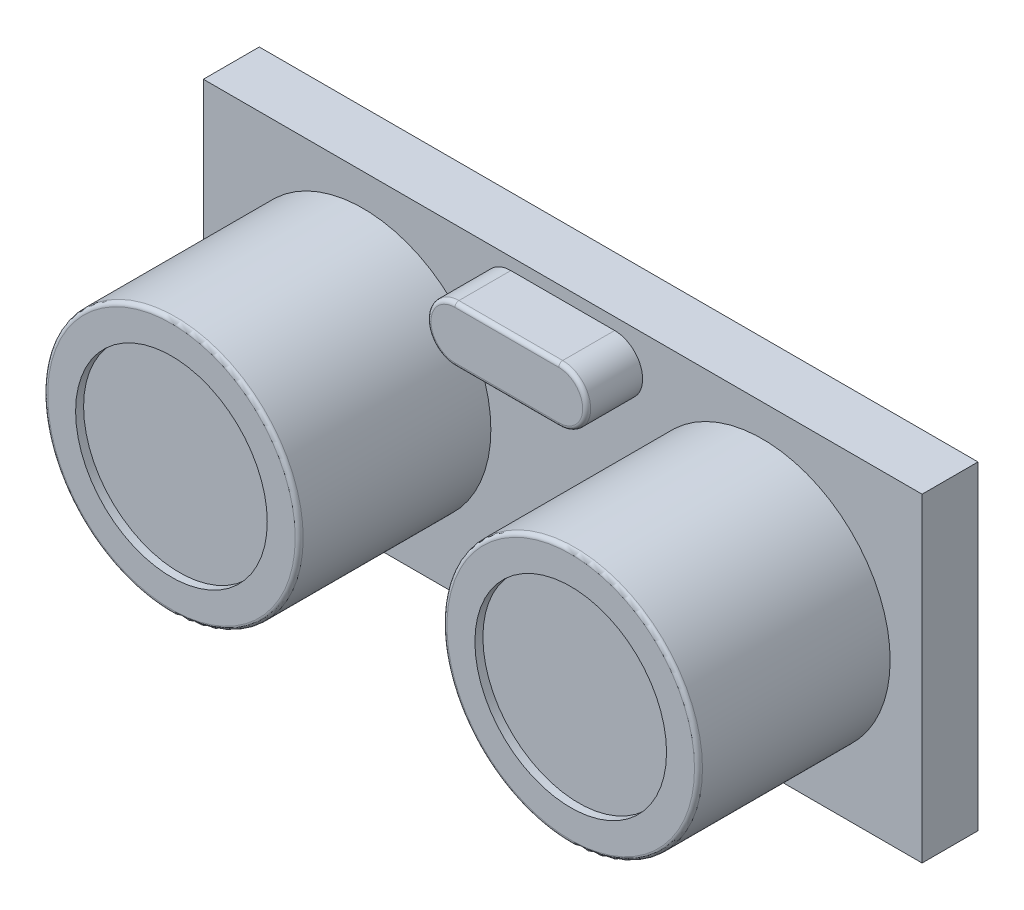
ISO-10303-21;
HEADER;
FILE_DESCRIPTION(('STEP AP214'),'2;1');
FILE_NAME('part.step','',(''),(''),'','','');
FILE_SCHEMA(('AUTOMOTIVE_DESIGN { 1 0 10303 214 1 1 1 1 }'));
ENDSEC;
DATA;
#1=APPLICATION_CONTEXT('core data for automotive mechanical design processes');
#2=APPLICATION_PROTOCOL_DEFINITION('international standard','automotive_design',2000,#1);
#3=PRODUCT_CONTEXT('',#1,'mechanical');
#4=PRODUCT('Part','Part','',(#3));
#5=PRODUCT_RELATED_PRODUCT_CATEGORY('part','',(#4));
#6=PRODUCT_DEFINITION_FORMATION('','',#4);
#7=PRODUCT_DEFINITION_CONTEXT('part definition',#1,'design');
#8=PRODUCT_DEFINITION('design','',#6,#7);
#9=PRODUCT_DEFINITION_SHAPE('','',#8);
#10=(LENGTH_UNIT() NAMED_UNIT(*) SI_UNIT(.MILLI.,.METRE.));
#11=(NAMED_UNIT(*) PLANE_ANGLE_UNIT() SI_UNIT($,.RADIAN.));
#12=(NAMED_UNIT(*) SI_UNIT($,.STERADIAN.) SOLID_ANGLE_UNIT());
#13=UNCERTAINTY_MEASURE_WITH_UNIT(LENGTH_MEASURE(1.E-05),#10,'distance_accuracy_value','');
#14=(GEOMETRIC_REPRESENTATION_CONTEXT(3) GLOBAL_UNCERTAINTY_ASSIGNED_CONTEXT((#13)) GLOBAL_UNIT_ASSIGNED_CONTEXT((#10,
#11,#12)) REPRESENTATION_CONTEXT('',''));
#15=CARTESIAN_POINT('',(0.,0.,0.));
#16=DIRECTION('',(0.,0.,1.));
#17=DIRECTION('',(1.,0.,0.));
#18=AXIS2_PLACEMENT_3D('',#15,#16,#17);
#19=CARTESIAN_POINT('',(0.,0.,3.5));
#20=DIRECTION('',(0.,0.,1.));
#21=DIRECTION('',(1.,0.,0.));
#22=AXIS2_PLACEMENT_3D('',#19,#20,#21);
#23=PLANE('',#22);
#24=CARTESIAN_POINT('',(-12.5,0.,3.5));
#25=DIRECTION('',(0.,0.,1.));
#26=DIRECTION('',(1.,0.,0.));
#27=AXIS2_PLACEMENT_3D('',#24,#25,#26);
#28=CIRCLE('',#27,8.);
#29=CARTESIAN_POINT('',(-4.49999999999999,0.,3.5));
#30=VERTEX_POINT('',#29);
#31=EDGE_CURVE('E148',#30,#30,#28,.T.);
#32=ORIENTED_EDGE('',*,*,#31,.F.);
#33=EDGE_LOOP('',(#32));
#34=FACE_BOUND('',#33,.T.);
#35=CARTESIAN_POINT('',(12.5,0.,3.5));
#36=DIRECTION('',(0.,0.,1.));
#37=DIRECTION('',(1.,0.,0.));
#38=AXIS2_PLACEMENT_3D('',#35,#36,#37);
#39=CIRCLE('',#38,8.00000000000001);
#40=CARTESIAN_POINT('',(20.5,0.,3.5));
#41=VERTEX_POINT('',#40);
#42=EDGE_CURVE('E153',#41,#41,#39,.T.);
#43=ORIENTED_EDGE('',*,*,#42,.F.);
#44=EDGE_LOOP('',(#43));
#45=FACE_BOUND('',#44,.T.);
#46=DIRECTION('',(0.,1.,0.));
#47=VECTOR('',#46,1.);
#48=CARTESIAN_POINT('',(22.5,10.,3.5));
#49=LINE('',#48,#47);
#50=CARTESIAN_POINT('',(22.5,-10.,3.5));
#51=VERTEX_POINT('',#50);
#52=CARTESIAN_POINT('',(22.5,10.,3.5));
#53=VERTEX_POINT('',#52);
#54=EDGE_CURVE('E157',#51,#53,#49,.T.);
#55=ORIENTED_EDGE('',*,*,#54,.T.);
#56=DIRECTION('',(-1.,0.,0.));
#57=VECTOR('',#56,1.);
#58=CARTESIAN_POINT('',(-22.5,10.,3.5));
#59=LINE('',#58,#57);
#60=CARTESIAN_POINT('',(-22.5,10.,3.5));
#61=VERTEX_POINT('',#60);
#62=EDGE_CURVE('E160',#53,#61,#59,.T.);
#63=ORIENTED_EDGE('',*,*,#62,.T.);
#64=DIRECTION('',(0.,-1.,0.));
#65=VECTOR('',#64,1.);
#66=CARTESIAN_POINT('',(-22.5,10.,3.5));
#67=LINE('',#66,#65);
#68=CARTESIAN_POINT('',(-22.5,-10.,3.5));
#69=VERTEX_POINT('',#68);
#70=EDGE_CURVE('E163',#61,#69,#67,.T.);
#71=ORIENTED_EDGE('',*,*,#70,.T.);
#72=DIRECTION('',(1.,0.,0.));
#73=VECTOR('',#72,1.);
#74=CARTESIAN_POINT('',(-22.5,-10.,3.5));
#75=LINE('',#74,#73);
#76=EDGE_CURVE('E165',#69,#51,#75,.T.);
#77=ORIENTED_EDGE('',*,*,#76,.T.);
#78=EDGE_LOOP('',(#55,#63,#71,#77));
#79=FACE_BOUND('',#78,.T.);
#80=DIRECTION('',(1.,0.,0.));
#81=VECTOR('',#80,1.);
#82=CARTESIAN_POINT('',(-3.25,5.75,3.5));
#83=LINE('',#82,#81);
#84=CARTESIAN_POINT('',(-3.25,5.75,3.5));
#85=VERTEX_POINT('',#84);
#86=CARTESIAN_POINT('',(3.25,5.75,3.5));
#87=VERTEX_POINT('',#86);
#88=EDGE_CURVE('E112',#85,#87,#83,.T.);
#89=ORIENTED_EDGE('',*,*,#88,.F.);
#90=CARTESIAN_POINT('',(-3.25,7.5,3.5));
#91=DIRECTION('',(0.,0.,1.));
#92=DIRECTION('',(1.,0.,0.));
#93=AXIS2_PLACEMENT_3D('',#90,#91,#92);
#94=CIRCLE('',#93,1.75);
#95=CARTESIAN_POINT('',(-3.25,9.25,3.5));
#96=VERTEX_POINT('',#95);
#97=EDGE_CURVE('E120',#96,#85,#94,.T.);
#98=ORIENTED_EDGE('',*,*,#97,.F.);
#99=DIRECTION('',(-1.,0.,0.));
#100=VECTOR('',#99,1.);
#101=CARTESIAN_POINT('',(-3.25,9.25,3.5));
#102=LINE('',#101,#100);
#103=CARTESIAN_POINT('',(3.25,9.25,3.5));
#104=VERTEX_POINT('',#103);
#105=EDGE_CURVE('E131',#104,#96,#102,.T.);
#106=ORIENTED_EDGE('',*,*,#105,.F.);
#107=CARTESIAN_POINT('',(3.25,7.5,3.5));
#108=DIRECTION('',(0.,0.,1.));
#109=DIRECTION('',(1.,0.,0.));
#110=AXIS2_PLACEMENT_3D('',#107,#108,#109);
#111=CIRCLE('',#110,1.75);
#112=EDGE_CURVE('E129',#87,#104,#111,.T.);
#113=ORIENTED_EDGE('',*,*,#112,.F.);
#114=EDGE_LOOP('',(#89,#98,#106,#113));
#115=FACE_BOUND('',#114,.T.);
#116=ADVANCED_FACE('F32',(#34,#45,#79,#115),#23,.T.);
#117=CARTESIAN_POINT('',(22.5,10.,3.5));
#118=DIRECTION('',(-1.,0.,0.));
#119=DIRECTION('',(0.,-1.,0.));
#120=AXIS2_PLACEMENT_3D('',#117,#118,#119);
#121=PLANE('',#120);
#122=DIRECTION('',(0.,1.,0.));
#123=VECTOR('',#122,1.);
#124=CARTESIAN_POINT('',(22.5,10.,0.));
#125=LINE('',#124,#123);
#126=CARTESIAN_POINT('',(22.5,-10.,0.));
#127=VERTEX_POINT('',#126);
#128=CARTESIAN_POINT('',(22.5,10.,0.));
#129=VERTEX_POINT('',#128);
#130=EDGE_CURVE('E156',#127,#129,#125,.T.);
#131=ORIENTED_EDGE('',*,*,#130,.T.);
#132=DIRECTION('',(0.,0.,-1.));
#133=VECTOR('',#132,1.);
#134=CARTESIAN_POINT('',(22.5,10.,3.5));
#135=LINE('',#134,#133);
#136=EDGE_CURVE('E183',#53,#129,#135,.T.);
#137=ORIENTED_EDGE('',*,*,#136,.F.);
#138=ORIENTED_EDGE('',*,*,#54,.F.);
#139=DIRECTION('',(0.,0.,-1.));
#140=VECTOR('',#139,1.);
#141=CARTESIAN_POINT('',(22.5,-10.,3.5));
#142=LINE('',#141,#140);
#143=EDGE_CURVE('E167',#51,#127,#142,.T.);
#144=ORIENTED_EDGE('',*,*,#143,.T.);
#145=EDGE_LOOP('',(#131,#137,#138,#144));
#146=FACE_BOUND('',#145,.T.);
#147=ADVANCED_FACE('F247',(#146),#121,.F.);
#148=CARTESIAN_POINT('',(-22.5,10.,3.5));
#149=DIRECTION('',(0.,-1.,0.));
#150=DIRECTION('',(0.,0.,-1.));
#151=AXIS2_PLACEMENT_3D('',#148,#149,#150);
#152=PLANE('',#151);
#153=DIRECTION('',(-1.,0.,0.));
#154=VECTOR('',#153,1.);
#155=CARTESIAN_POINT('',(-22.5,10.,0.));
#156=LINE('',#155,#154);
#157=CARTESIAN_POINT('',(-22.5,10.,0.));
#158=VERTEX_POINT('',#157);
#159=EDGE_CURVE('E170',#129,#158,#156,.T.);
#160=ORIENTED_EDGE('',*,*,#159,.T.);
#161=DIRECTION('',(0.,0.,-1.));
#162=VECTOR('',#161,1.);
#163=CARTESIAN_POINT('',(-22.5,10.,3.5));
#164=LINE('',#163,#162);
#165=EDGE_CURVE('E180',#61,#158,#164,.T.);
#166=ORIENTED_EDGE('',*,*,#165,.F.);
#167=ORIENTED_EDGE('',*,*,#62,.F.);
#168=ORIENTED_EDGE('',*,*,#136,.T.);
#169=EDGE_LOOP('',(#160,#166,#167,#168));
#170=FACE_BOUND('',#169,.T.);
#171=ADVANCED_FACE('F253',(#170),#152,.F.);
#172=CARTESIAN_POINT('',(-22.5,10.,3.5));
#173=DIRECTION('',(1.,0.,0.));
#174=DIRECTION('',(0.,1.,0.));
#175=AXIS2_PLACEMENT_3D('',#172,#173,#174);
#176=PLANE('',#175);
#177=DIRECTION('',(0.,-1.,0.));
#178=VECTOR('',#177,1.);
#179=CARTESIAN_POINT('',(-22.5,10.,0.));
#180=LINE('',#179,#178);
#181=CARTESIAN_POINT('',(-22.5,-10.,0.));
#182=VERTEX_POINT('',#181);
#183=EDGE_CURVE('E172',#158,#182,#180,.T.);
#184=ORIENTED_EDGE('',*,*,#183,.T.);
#185=DIRECTION('',(0.,0.,-1.));
#186=VECTOR('',#185,1.);
#187=CARTESIAN_POINT('',(-22.5,-10.,3.5));
#188=LINE('',#187,#186);
#189=EDGE_CURVE('E177',#69,#182,#188,.T.);
#190=ORIENTED_EDGE('',*,*,#189,.F.);
#191=ORIENTED_EDGE('',*,*,#70,.F.);
#192=ORIENTED_EDGE('',*,*,#165,.T.);
#193=EDGE_LOOP('',(#184,#190,#191,#192));
#194=FACE_BOUND('',#193,.T.);
#195=ADVANCED_FACE('F269',(#194),#176,.F.);
#196=CARTESIAN_POINT('',(-22.5,-10.,3.5));
#197=DIRECTION('',(0.,1.,0.));
#198=DIRECTION('',(0.,0.,1.));
#199=AXIS2_PLACEMENT_3D('',#196,#197,#198);
#200=PLANE('',#199);
#201=DIRECTION('',(1.,0.,0.));
#202=VECTOR('',#201,1.);
#203=CARTESIAN_POINT('',(-22.5,-10.,0.));
#204=LINE('',#203,#202);
#205=EDGE_CURVE('E161',#182,#127,#204,.T.);
#206=ORIENTED_EDGE('',*,*,#205,.T.);
#207=ORIENTED_EDGE('',*,*,#143,.F.);
#208=ORIENTED_EDGE('',*,*,#76,.F.);
#209=ORIENTED_EDGE('',*,*,#189,.T.);
#210=EDGE_LOOP('',(#206,#207,#208,#209));
#211=FACE_BOUND('',#210,.T.);
#212=ADVANCED_FACE('F265',(#211),#200,.F.);
#213=CARTESIAN_POINT('',(0.,0.,0.));
#214=DIRECTION('',(0.,0.,1.));
#215=DIRECTION('',(1.,0.,0.));
#216=AXIS2_PLACEMENT_3D('',#213,#214,#215);
#217=PLANE('',#216);
#218=ORIENTED_EDGE('',*,*,#130,.F.);
#219=ORIENTED_EDGE('',*,*,#205,.F.);
#220=ORIENTED_EDGE('',*,*,#183,.F.);
#221=ORIENTED_EDGE('',*,*,#159,.F.);
#222=EDGE_LOOP('',(#218,#219,#220,#221));
#223=FACE_BOUND('',#222,.T.);
#224=ADVANCED_FACE('F262',(#223),#217,.F.);
#225=CARTESIAN_POINT('',(12.5,0.,15.5));
#226=DIRECTION('',(0.,0.,-1.));
#227=DIRECTION('',(-1.,0.,0.));
#228=AXIS2_PLACEMENT_3D('',#225,#226,#227);
#229=CYLINDRICAL_SURFACE('',#228,8.00000000000001);
#230=CARTESIAN_POINT('',(12.5,0.,15.25));
#231=DIRECTION('',(0.,0.,1.));
#232=DIRECTION('',(1.,0.,0.));
#233=AXIS2_PLACEMENT_3D('',#230,#231,#232);
#234=CIRCLE('',#233,8.00000000000001);
#235=CARTESIAN_POINT('',(20.5,0.,15.25));
#236=VERTEX_POINT('',#235);
#237=EDGE_CURVE('E189',#236,#236,#234,.F.);
#238=ORIENTED_EDGE('',*,*,#237,.T.);
#239=EDGE_LOOP('',(#238));
#240=FACE_BOUND('',#239,.T.);
#241=ORIENTED_EDGE('',*,*,#42,.T.);
#242=EDGE_LOOP('',(#241));
#243=FACE_BOUND('',#242,.T.);
#244=ADVANCED_FACE('F260',(#240,#243),#229,.T.);
#245=CARTESIAN_POINT('',(12.5,0.,15.5));
#246=DIRECTION('',(0.,0.,1.));
#247=DIRECTION('',(1.,0.,0.));
#248=AXIS2_PLACEMENT_3D('',#245,#246,#247);
#249=PLANE('',#248);
#250=CARTESIAN_POINT('',(12.5,0.,15.5));
#251=DIRECTION('',(0.,0.,1.));
#252=DIRECTION('',(1.,0.,0.));
#253=AXIS2_PLACEMENT_3D('',#250,#251,#252);
#254=CIRCLE('',#253,7.75000000000001);
#255=CARTESIAN_POINT('',(20.25,0.,15.5));
#256=VERTEX_POINT('',#255);
#257=EDGE_CURVE('E186',#256,#256,#254,.T.);
#258=ORIENTED_EDGE('',*,*,#257,.T.);
#259=EDGE_LOOP('',(#258));
#260=FACE_BOUND('',#259,.T.);
#261=CARTESIAN_POINT('',(12.5,0.,15.5));
#262=DIRECTION('',(0.,0.,1.));
#263=DIRECTION('',(1.,0.,0.));
#264=AXIS2_PLACEMENT_3D('',#261,#262,#263);
#265=CIRCLE('',#264,6.00000000000001);
#266=CARTESIAN_POINT('',(18.5,0.,15.5));
#267=VERTEX_POINT('',#266);
#268=EDGE_CURVE('E116',#267,#267,#265,.T.);
#269=ORIENTED_EDGE('',*,*,#268,.F.);
#270=EDGE_LOOP('',(#269));
#271=FACE_BOUND('',#270,.T.);
#272=ADVANCED_FACE('F411',(#260,#271),#249,.T.);
#273=CARTESIAN_POINT('',(-12.5,0.,15.5));
#274=DIRECTION('',(0.,0.,-1.));
#275=DIRECTION('',(-1.,0.,0.));
#276=AXIS2_PLACEMENT_3D('',#273,#274,#275);
#277=CYLINDRICAL_SURFACE('',#276,8.);
#278=CARTESIAN_POINT('',(-12.5,0.,15.25));
#279=DIRECTION('',(0.,0.,1.));
#280=DIRECTION('',(1.,0.,0.));
#281=AXIS2_PLACEMENT_3D('',#278,#279,#280);
#282=CIRCLE('',#281,8.);
#283=CARTESIAN_POINT('',(-4.49999999999999,0.,15.25));
#284=VERTEX_POINT('',#283);
#285=EDGE_CURVE('E195',#284,#284,#282,.F.);
#286=ORIENTED_EDGE('',*,*,#285,.T.);
#287=EDGE_LOOP('',(#286));
#288=FACE_BOUND('',#287,.T.);
#289=ORIENTED_EDGE('',*,*,#31,.T.);
#290=EDGE_LOOP('',(#289));
#291=FACE_BOUND('',#290,.T.);
#292=ADVANCED_FACE('F402',(#288,#291),#277,.T.);
#293=CARTESIAN_POINT('',(-12.5,0.,15.5));
#294=DIRECTION('',(0.,0.,1.));
#295=DIRECTION('',(1.,0.,0.));
#296=AXIS2_PLACEMENT_3D('',#293,#294,#295);
#297=PLANE('',#296);
#298=CARTESIAN_POINT('',(-12.5,0.,15.5));
#299=DIRECTION('',(0.,0.,1.));
#300=DIRECTION('',(1.,0.,0.));
#301=AXIS2_PLACEMENT_3D('',#298,#299,#300);
#302=CIRCLE('',#301,7.75);
#303=CARTESIAN_POINT('',(-4.74999999999999,0.,15.5));
#304=VERTEX_POINT('',#303);
#305=EDGE_CURVE('E192',#304,#304,#302,.T.);
#306=ORIENTED_EDGE('',*,*,#305,.T.);
#307=EDGE_LOOP('',(#306));
#308=FACE_BOUND('',#307,.T.);
#309=CARTESIAN_POINT('',(-12.5,0.,15.5));
#310=DIRECTION('',(0.,0.,1.));
#311=DIRECTION('',(1.,0.,0.));
#312=AXIS2_PLACEMENT_3D('',#309,#310,#311);
#313=CIRCLE('',#312,6.00000000000001);
#314=CARTESIAN_POINT('',(-6.49999999999998,0.,15.5));
#315=VERTEX_POINT('',#314);
#316=EDGE_CURVE('E142',#315,#315,#313,.T.);
#317=ORIENTED_EDGE('',*,*,#316,.F.);
#318=EDGE_LOOP('',(#317));
#319=FACE_BOUND('',#318,.T.);
#320=ADVANCED_FACE('F393',(#308,#319),#297,.T.);
#321=CARTESIAN_POINT('',(-12.5,0.,15.));
#322=DIRECTION('',(0.,0.,1.));
#323=DIRECTION('',(1.,0.,0.));
#324=AXIS2_PLACEMENT_3D('',#321,#322,#323);
#325=CYLINDRICAL_SURFACE('',#324,6.00000000000001);
#326=CARTESIAN_POINT('',(-12.5,0.,15.));
#327=DIRECTION('',(0.,0.,1.));
#328=DIRECTION('',(1.,0.,0.));
#329=AXIS2_PLACEMENT_3D('',#326,#327,#328);
#330=CIRCLE('',#329,6.00000000000001);
#331=CARTESIAN_POINT('',(-6.49999999999998,0.,15.));
#332=VERTEX_POINT('',#331);
#333=EDGE_CURVE('E145',#332,#332,#330,.T.);
#334=ORIENTED_EDGE('',*,*,#333,.F.);
#335=EDGE_LOOP('',(#334));
#336=FACE_BOUND('',#335,.T.);
#337=ORIENTED_EDGE('',*,*,#316,.T.);
#338=EDGE_LOOP('',(#337));
#339=FACE_BOUND('',#338,.T.);
#340=ADVANCED_FACE('F384',(#336,#339),#325,.F.);
#341=CARTESIAN_POINT('',(-12.5,0.,15.));
#342=DIRECTION('',(0.,0.,1.));
#343=DIRECTION('',(1.,0.,0.));
#344=AXIS2_PLACEMENT_3D('',#341,#342,#343);
#345=PLANE('',#344);
#346=ORIENTED_EDGE('',*,*,#333,.T.);
#347=EDGE_LOOP('',(#346));
#348=FACE_BOUND('',#347,.T.);
#349=ADVANCED_FACE('F375',(#348),#345,.T.);
#350=CARTESIAN_POINT('',(12.5,0.,15.));
#351=DIRECTION('',(0.,0.,1.));
#352=DIRECTION('',(1.,0.,0.));
#353=AXIS2_PLACEMENT_3D('',#350,#351,#352);
#354=CYLINDRICAL_SURFACE('',#353,6.00000000000001);
#355=CARTESIAN_POINT('',(12.5,0.,15.));
#356=DIRECTION('',(0.,0.,1.));
#357=DIRECTION('',(1.,0.,0.));
#358=AXIS2_PLACEMENT_3D('',#355,#356,#357);
#359=CIRCLE('',#358,6.00000000000001);
#360=CARTESIAN_POINT('',(18.5,0.,15.));
#361=VERTEX_POINT('',#360);
#362=EDGE_CURVE('E139',#361,#361,#359,.T.);
#363=ORIENTED_EDGE('',*,*,#362,.F.);
#364=EDGE_LOOP('',(#363));
#365=FACE_BOUND('',#364,.T.);
#366=ORIENTED_EDGE('',*,*,#268,.T.);
#367=EDGE_LOOP('',(#366));
#368=FACE_BOUND('',#367,.T.);
#369=ADVANCED_FACE('F365',(#365,#368),#354,.F.);
#370=CARTESIAN_POINT('',(12.5,0.,15.));
#371=DIRECTION('',(0.,0.,1.));
#372=DIRECTION('',(1.,0.,0.));
#373=AXIS2_PLACEMENT_3D('',#370,#371,#372);
#374=PLANE('',#373);
#375=ORIENTED_EDGE('',*,*,#362,.T.);
#376=EDGE_LOOP('',(#375));
#377=FACE_BOUND('',#376,.T.);
#378=ADVANCED_FACE('F281',(#377),#374,.T.);
#379=CARTESIAN_POINT('',(12.5,0.,15.25));
#380=DIRECTION('',(0.,0.,1.));
#381=DIRECTION('',(1.,0.,0.));
#382=AXIS2_PLACEMENT_3D('',#379,#380,#381);
#383=TOROIDAL_SURFACE('',#382,7.75000000000001,0.25);
#384=ORIENTED_EDGE('',*,*,#237,.F.);
#385=EDGE_LOOP('',(#384));
#386=FACE_BOUND('',#385,.T.);
#387=ORIENTED_EDGE('',*,*,#257,.F.);
#388=EDGE_LOOP('',(#387));
#389=FACE_BOUND('',#388,.T.);
#390=ADVANCED_FACE('F277',(#386,#389),#383,.T.);
#391=CARTESIAN_POINT('',(-12.5,0.,15.25));
#392=DIRECTION('',(0.,0.,1.));
#393=DIRECTION('',(1.,0.,0.));
#394=AXIS2_PLACEMENT_3D('',#391,#392,#393);
#395=TOROIDAL_SURFACE('',#394,7.75,0.25);
#396=ORIENTED_EDGE('',*,*,#285,.F.);
#397=EDGE_LOOP('',(#396));
#398=FACE_BOUND('',#397,.T.);
#399=ORIENTED_EDGE('',*,*,#305,.F.);
#400=EDGE_LOOP('',(#399));
#401=FACE_BOUND('',#400,.T.);
#402=ADVANCED_FACE('F280',(#398,#401),#395,.T.);
#403=CARTESIAN_POINT('',(-3.25,7.5,7.));
#404=DIRECTION('',(0.,0.,-1.));
#405=DIRECTION('',(-1.,0.,0.));
#406=AXIS2_PLACEMENT_3D('',#403,#404,#405);
#407=CYLINDRICAL_SURFACE('',#406,1.75);
#408=DIRECTION('',(0.,0.,-1.));
#409=VECTOR('',#408,1.);
#410=CARTESIAN_POINT('',(-3.25,5.75,7.));
#411=LINE('',#410,#409);
#412=CARTESIAN_POINT('',(-3.25,5.75,6.75));
#413=VERTEX_POINT('',#412);
#414=EDGE_CURVE('E108',#413,#85,#411,.T.);
#415=ORIENTED_EDGE('',*,*,#414,.F.);
#416=CARTESIAN_POINT('',(-3.25,7.5,6.75));
#417=DIRECTION('',(0.,0.,1.));
#418=DIRECTION('',(1.,0.,0.));
#419=AXIS2_PLACEMENT_3D('',#416,#417,#418);
#420=CIRCLE('',#419,1.75);
#421=CARTESIAN_POINT('',(-3.25,9.25,6.75));
#422=VERTEX_POINT('',#421);
#423=EDGE_CURVE('E11',#413,#422,#420,.F.);
#424=ORIENTED_EDGE('',*,*,#423,.T.);
#425=DIRECTION('',(0.,0.,-1.));
#426=VECTOR('',#425,1.);
#427=CARTESIAN_POINT('',(-3.25,9.25,7.));
#428=LINE('',#427,#426);
#429=EDGE_CURVE('E123',#422,#96,#428,.T.);
#430=ORIENTED_EDGE('',*,*,#429,.T.);
#431=ORIENTED_EDGE('',*,*,#97,.T.);
#432=EDGE_LOOP('',(#415,#424,#430,#431));
#433=FACE_BOUND('',#432,.T.);
#434=ADVANCED_FACE('F121',(#433),#407,.T.);
#435=CARTESIAN_POINT('',(-3.25,5.75,7.));
#436=DIRECTION('',(0.,1.,0.));
#437=DIRECTION('',(0.,0.,1.));
#438=AXIS2_PLACEMENT_3D('',#435,#436,#437);
#439=PLANE('',#438);
#440=DIRECTION('',(0.,0.,-1.));
#441=VECTOR('',#440,1.);
#442=CARTESIAN_POINT('',(3.25,5.75,7.));
#443=LINE('',#442,#441);
#444=CARTESIAN_POINT('',(3.25,5.75,6.75));
#445=VERTEX_POINT('',#444);
#446=EDGE_CURVE('E117',#445,#87,#443,.T.);
#447=ORIENTED_EDGE('',*,*,#446,.F.);
#448=DIRECTION('',(1.,0.,0.));
#449=VECTOR('',#448,1.);
#450=CARTESIAN_POINT('',(-3.25,5.75,6.75));
#451=LINE('',#450,#449);
#452=EDGE_CURVE('E41',#445,#413,#451,.F.);
#453=ORIENTED_EDGE('',*,*,#452,.T.);
#454=ORIENTED_EDGE('',*,*,#414,.T.);
#455=ORIENTED_EDGE('',*,*,#88,.T.);
#456=EDGE_LOOP('',(#447,#453,#454,#455));
#457=FACE_BOUND('',#456,.T.);
#458=ADVANCED_FACE('F110',(#457),#439,.F.);
#459=CARTESIAN_POINT('',(3.25,7.5,7.));
#460=DIRECTION('',(0.,0.,-1.));
#461=DIRECTION('',(-1.,0.,0.));
#462=AXIS2_PLACEMENT_3D('',#459,#460,#461);
#463=CYLINDRICAL_SURFACE('',#462,1.75);
#464=DIRECTION('',(0.,0.,-1.));
#465=VECTOR('',#464,1.);
#466=CARTESIAN_POINT('',(3.25,9.25,7.));
#467=LINE('',#466,#465);
#468=CARTESIAN_POINT('',(3.25,9.25,6.75));
#469=VERTEX_POINT('',#468);
#470=EDGE_CURVE('E136',#469,#104,#467,.T.);
#471=ORIENTED_EDGE('',*,*,#470,.F.);
#472=CARTESIAN_POINT('',(3.25,7.5,6.75));
#473=DIRECTION('',(0.,0.,1.));
#474=DIRECTION('',(1.,0.,0.));
#475=AXIS2_PLACEMENT_3D('',#472,#473,#474);
#476=CIRCLE('',#475,1.75);
#477=EDGE_CURVE('E56',#469,#445,#476,.F.);
#478=ORIENTED_EDGE('',*,*,#477,.T.);
#479=ORIENTED_EDGE('',*,*,#446,.T.);
#480=ORIENTED_EDGE('',*,*,#112,.T.);
#481=EDGE_LOOP('',(#471,#478,#479,#480));
#482=FACE_BOUND('',#481,.T.);
#483=ADVANCED_FACE('F244',(#482),#463,.T.);
#484=CARTESIAN_POINT('',(-3.25,9.25,7.));
#485=DIRECTION('',(0.,-1.,0.));
#486=DIRECTION('',(0.,0.,-1.));
#487=AXIS2_PLACEMENT_3D('',#484,#485,#486);
#488=PLANE('',#487);
#489=ORIENTED_EDGE('',*,*,#429,.F.);
#490=DIRECTION('',(-1.,0.,0.));
#491=VECTOR('',#490,1.);
#492=CARTESIAN_POINT('',(3.25,9.25,6.75));
#493=LINE('',#492,#491);
#494=EDGE_CURVE('E207',#422,#469,#493,.F.);
#495=ORIENTED_EDGE('',*,*,#494,.T.);
#496=ORIENTED_EDGE('',*,*,#470,.T.);
#497=ORIENTED_EDGE('',*,*,#105,.T.);
#498=EDGE_LOOP('',(#489,#495,#496,#497));
#499=FACE_BOUND('',#498,.T.);
#500=ADVANCED_FACE('F232',(#499),#488,.F.);
#501=CARTESIAN_POINT('',(-3.25,7.5,7.));
#502=DIRECTION('',(0.,0.,1.));
#503=DIRECTION('',(1.,0.,0.));
#504=AXIS2_PLACEMENT_3D('',#501,#502,#503);
#505=PLANE('',#504);
#506=CARTESIAN_POINT('',(3.25,7.5,7.));
#507=DIRECTION('',(0.,0.,1.));
#508=DIRECTION('',(1.,0.,0.));
#509=AXIS2_PLACEMENT_3D('',#506,#507,#508);
#510=CIRCLE('',#509,1.5);
#511=CARTESIAN_POINT('',(3.25,6.,7.));
#512=VERTEX_POINT('',#511);
#513=CARTESIAN_POINT('',(3.25,9.,7.));
#514=VERTEX_POINT('',#513);
#515=EDGE_CURVE('E202',#512,#514,#510,.T.);
#516=ORIENTED_EDGE('',*,*,#515,.T.);
#517=DIRECTION('',(-1.,0.,0.));
#518=VECTOR('',#517,1.);
#519=CARTESIAN_POINT('',(-3.25,9.,7.));
#520=LINE('',#519,#518);
#521=CARTESIAN_POINT('',(-3.25,9.,7.));
#522=VERTEX_POINT('',#521);
#523=EDGE_CURVE('E204',#514,#522,#520,.T.);
#524=ORIENTED_EDGE('',*,*,#523,.T.);
#525=CARTESIAN_POINT('',(-3.25,7.5,7.));
#526=DIRECTION('',(0.,0.,1.));
#527=DIRECTION('',(1.,0.,0.));
#528=AXIS2_PLACEMENT_3D('',#525,#526,#527);
#529=CIRCLE('',#528,1.5);
#530=CARTESIAN_POINT('',(-3.25,6.,7.));
#531=VERTEX_POINT('',#530);
#532=EDGE_CURVE('E198',#522,#531,#529,.T.);
#533=ORIENTED_EDGE('',*,*,#532,.T.);
#534=DIRECTION('',(1.,0.,0.));
#535=VECTOR('',#534,1.);
#536=CARTESIAN_POINT('',(3.25,6.,7.));
#537=LINE('',#536,#535);
#538=EDGE_CURVE('E200',#531,#512,#537,.T.);
#539=ORIENTED_EDGE('',*,*,#538,.T.);
#540=EDGE_LOOP('',(#516,#524,#533,#539));
#541=FACE_BOUND('',#540,.T.);
#542=ADVANCED_FACE('F237',(#541),#505,.T.);
#543=CARTESIAN_POINT('',(-3.25,6.,6.75));
#544=DIRECTION('',(-1.,0.,0.));
#545=DIRECTION('',(0.,0.,1.));
#546=AXIS2_PLACEMENT_3D('',#543,#544,#545);
#547=CYLINDRICAL_SURFACE('',#546,0.25);
#548=CARTESIAN_POINT('',(-3.25,6.,6.75));
#549=DIRECTION('',(-1.,0.,0.));
#550=DIRECTION('',(0.,0.,1.));
#551=AXIS2_PLACEMENT_3D('',#548,#549,#550);
#552=CIRCLE('',#551,0.25);
#553=EDGE_CURVE('E215',#413,#531,#552,.T.);
#554=ORIENTED_EDGE('',*,*,#553,.F.);
#555=ORIENTED_EDGE('',*,*,#452,.F.);
#556=CARTESIAN_POINT('',(3.25,6.,6.75));
#557=DIRECTION('',(1.,0.,0.));
#558=DIRECTION('',(0.,0.,-1.));
#559=AXIS2_PLACEMENT_3D('',#556,#557,#558);
#560=CIRCLE('',#559,0.25);
#561=EDGE_CURVE('E36',#512,#445,#560,.T.);
#562=ORIENTED_EDGE('',*,*,#561,.F.);
#563=ORIENTED_EDGE('',*,*,#538,.F.);
#564=EDGE_LOOP('',(#554,#555,#562,#563));
#565=FACE_BOUND('',#564,.T.);
#566=ADVANCED_FACE('F34',(#565),#547,.T.);
#567=CARTESIAN_POINT('',(3.25,7.5,6.75));
#568=DIRECTION('',(0.,0.,1.));
#569=DIRECTION('',(1.,0.,0.));
#570=AXIS2_PLACEMENT_3D('',#567,#568,#569);
#571=TOROIDAL_SURFACE('',#570,1.5,0.25);
#572=ORIENTED_EDGE('',*,*,#561,.T.);
#573=ORIENTED_EDGE('',*,*,#477,.F.);
#574=CARTESIAN_POINT('',(3.25,9.,6.75));
#575=DIRECTION('',(-1.,0.,0.));
#576=DIRECTION('',(0.,0.,1.));
#577=AXIS2_PLACEMENT_3D('',#574,#575,#576);
#578=CIRCLE('',#577,0.25);
#579=EDGE_CURVE('E214',#514,#469,#578,.T.);
#580=ORIENTED_EDGE('',*,*,#579,.F.);
#581=ORIENTED_EDGE('',*,*,#515,.F.);
#582=EDGE_LOOP('',(#572,#573,#580,#581));
#583=FACE_BOUND('',#582,.T.);
#584=ADVANCED_FACE('F224',(#583),#571,.T.);
#585=CARTESIAN_POINT('',(-3.25,7.5,6.75));
#586=DIRECTION('',(0.,0.,1.));
#587=DIRECTION('',(1.,0.,0.));
#588=AXIS2_PLACEMENT_3D('',#585,#586,#587);
#589=TOROIDAL_SURFACE('',#588,1.5,0.25);
#590=ORIENTED_EDGE('',*,*,#553,.T.);
#591=ORIENTED_EDGE('',*,*,#532,.F.);
#592=CARTESIAN_POINT('',(-3.25,9.,6.75));
#593=DIRECTION('',(1.,0.,0.));
#594=DIRECTION('',(0.,0.,-1.));
#595=AXIS2_PLACEMENT_3D('',#592,#593,#594);
#596=CIRCLE('',#595,0.25);
#597=EDGE_CURVE('E212',#422,#522,#596,.T.);
#598=ORIENTED_EDGE('',*,*,#597,.F.);
#599=ORIENTED_EDGE('',*,*,#423,.F.);
#600=EDGE_LOOP('',(#590,#591,#598,#599));
#601=FACE_BOUND('',#600,.T.);
#602=ADVANCED_FACE('F229',(#601),#589,.T.);
#603=CARTESIAN_POINT('',(-3.25,9.,6.75));
#604=DIRECTION('',(1.,0.,0.));
#605=DIRECTION('',(0.,0.,-1.));
#606=AXIS2_PLACEMENT_3D('',#603,#604,#605);
#607=CYLINDRICAL_SURFACE('',#606,0.25);
#608=ORIENTED_EDGE('',*,*,#579,.T.);
#609=ORIENTED_EDGE('',*,*,#494,.F.);
#610=ORIENTED_EDGE('',*,*,#597,.T.);
#611=ORIENTED_EDGE('',*,*,#523,.F.);
#612=EDGE_LOOP('',(#608,#609,#610,#611));
#613=FACE_BOUND('',#612,.T.);
#614=ADVANCED_FACE('F234',(#613),#607,.T.);
#615=CLOSED_SHELL('',(#116,#147,#171,#195,#212,#224,#244,#272,#292,#320,#340,#349,#369,#378,
#390,#402,#434,#458,#483,#500,#542,#566,#584,#602,#614));
#616=MANIFOLD_SOLID_BREP('B2',#615);
#617=ADVANCED_BREP_SHAPE_REPRESENTATION('',(#18,#616),#14);
#618=SHAPE_DEFINITION_REPRESENTATION(#9,#617);
ENDSEC;
END-ISO-10303-21;
